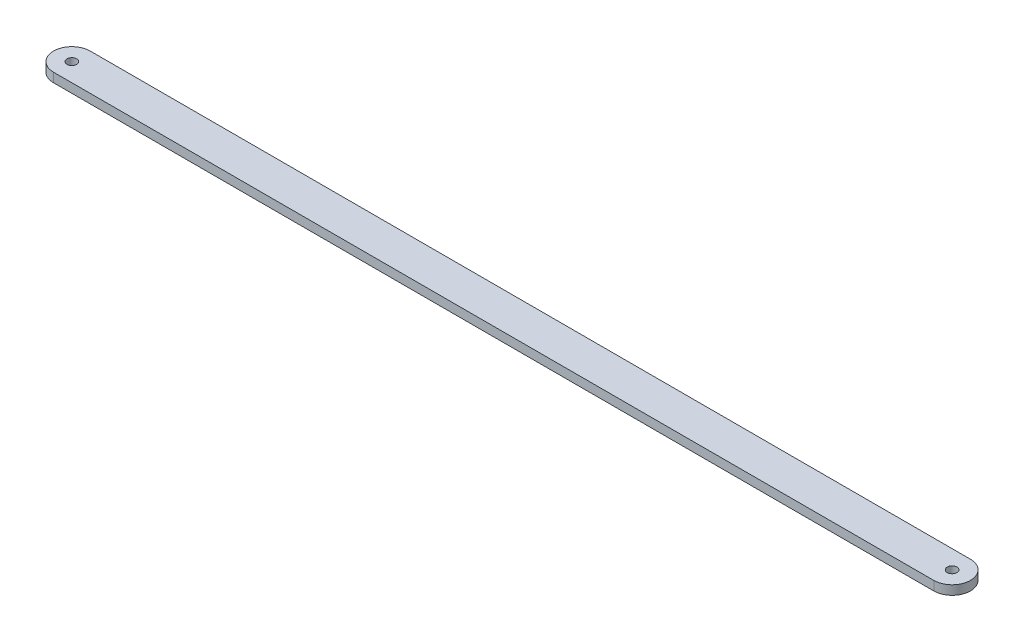
ISO-10303-21;
HEADER;
FILE_DESCRIPTION(('STEP AP214'),'2;1');
FILE_NAME('part.step','',(''),(''),'','','');
FILE_SCHEMA(('AUTOMOTIVE_DESIGN { 1 0 10303 214 1 1 1 1 }'));
ENDSEC;
DATA;
#1=APPLICATION_CONTEXT('core data for automotive mechanical design processes');
#2=APPLICATION_PROTOCOL_DEFINITION('international standard','automotive_design',2000,#1);
#3=PRODUCT_CONTEXT('',#1,'mechanical');
#4=PRODUCT('Part','Part','',(#3));
#5=PRODUCT_RELATED_PRODUCT_CATEGORY('part','',(#4));
#6=PRODUCT_DEFINITION_FORMATION('','',#4);
#7=PRODUCT_DEFINITION_CONTEXT('part definition',#1,'design');
#8=PRODUCT_DEFINITION('design','',#6,#7);
#9=PRODUCT_DEFINITION_SHAPE('','',#8);
#10=(LENGTH_UNIT() NAMED_UNIT(*) SI_UNIT(.MILLI.,.METRE.));
#11=(NAMED_UNIT(*) PLANE_ANGLE_UNIT() SI_UNIT($,.RADIAN.));
#12=(NAMED_UNIT(*) SI_UNIT($,.STERADIAN.) SOLID_ANGLE_UNIT());
#13=UNCERTAINTY_MEASURE_WITH_UNIT(LENGTH_MEASURE(1.E-05),#10,'distance_accuracy_value','');
#14=(GEOMETRIC_REPRESENTATION_CONTEXT(3) GLOBAL_UNCERTAINTY_ASSIGNED_CONTEXT((#13)) GLOBAL_UNIT_ASSIGNED_CONTEXT((#10,
#11,#12)) REPRESENTATION_CONTEXT('',''));
#15=CARTESIAN_POINT('',(0.,0.,0.));
#16=DIRECTION('',(0.,0.,1.));
#17=DIRECTION('',(1.,0.,0.));
#18=AXIS2_PLACEMENT_3D('',#15,#16,#17);
#19=CARTESIAN_POINT('',(-304.8,6.35,0.));
#20=DIRECTION('',(0.,1.,0.));
#21=DIRECTION('',(0.,0.,1.));
#22=AXIS2_PLACEMENT_3D('',#19,#20,#21);
#23=PLANE('',#22);
#24=CARTESIAN_POINT('',(304.8,6.35,0.));
#25=DIRECTION('',(0.,1.,0.));
#26=DIRECTION('',(0.,0.,1.));
#27=AXIS2_PLACEMENT_3D('',#24,#25,#26);
#28=CIRCLE('',#27,3.36550000000002);
#29=CARTESIAN_POINT('',(304.8,6.35,3.36550000000002));
#30=VERTEX_POINT('',#29);
#31=EDGE_CURVE('E112',#30,#30,#28,.T.);
#32=ORIENTED_EDGE('',*,*,#31,.F.);
#33=EDGE_LOOP('',(#32));
#34=FACE_BOUND('',#33,.T.);
#35=CARTESIAN_POINT('',(-304.8,6.35,0.));
#36=DIRECTION('',(0.,1.,0.));
#37=DIRECTION('',(0.,0.,1.));
#38=AXIS2_PLACEMENT_3D('',#35,#36,#37);
#39=CIRCLE('',#38,12.7);
#40=CARTESIAN_POINT('',(-304.8,6.35,-12.7000000000001));
#41=VERTEX_POINT('',#40);
#42=CARTESIAN_POINT('',(-304.8,6.35,12.6999999999999));
#43=VERTEX_POINT('',#42);
#44=EDGE_CURVE('E92',#41,#43,#39,.T.);
#45=ORIENTED_EDGE('',*,*,#44,.T.);
#46=DIRECTION('',(1.,0.,0.));
#47=VECTOR('',#46,1.);
#48=CARTESIAN_POINT('',(-304.8,6.35,12.6999999999999));
#49=LINE('',#48,#47);
#50=CARTESIAN_POINT('',(304.8,6.35,12.7000000000001));
#51=VERTEX_POINT('',#50);
#52=EDGE_CURVE('E87',#43,#51,#49,.T.);
#53=ORIENTED_EDGE('',*,*,#52,.T.);
#54=CARTESIAN_POINT('',(304.8,6.35,0.));
#55=DIRECTION('',(0.,1.,0.));
#56=DIRECTION('',(0.,0.,1.));
#57=AXIS2_PLACEMENT_3D('',#54,#55,#56);
#58=CIRCLE('',#57,12.7000000000001);
#59=CARTESIAN_POINT('',(304.8,6.35,-12.7000000000002));
#60=VERTEX_POINT('',#59);
#61=EDGE_CURVE('E90',#51,#60,#58,.T.);
#62=ORIENTED_EDGE('',*,*,#61,.T.);
#63=DIRECTION('',(-1.,0.,0.));
#64=VECTOR('',#63,1.);
#65=CARTESIAN_POINT('',(-304.8,6.35,-12.7000000000001));
#66=LINE('',#65,#64);
#67=EDGE_CURVE('E57',#60,#41,#66,.T.);
#68=ORIENTED_EDGE('',*,*,#67,.T.);
#69=EDGE_LOOP('',(#45,#53,#62,#68));
#70=FACE_BOUND('',#69,.T.);
#71=CARTESIAN_POINT('',(-304.8,6.35,0.));
#72=DIRECTION('',(0.,1.,0.));
#73=DIRECTION('',(0.,0.,1.));
#74=AXIS2_PLACEMENT_3D('',#71,#72,#73);
#75=CIRCLE('',#74,3.36550000000002);
#76=CARTESIAN_POINT('',(-304.8,6.35,3.36550000000002));
#77=VERTEX_POINT('',#76);
#78=EDGE_CURVE('E134',#77,#77,#75,.T.);
#79=ORIENTED_EDGE('',*,*,#78,.F.);
#80=EDGE_LOOP('',(#79));
#81=FACE_BOUND('',#80,.T.);
#82=ADVANCED_FACE('F39',(#34,#70,#81),#23,.T.);
#83=CARTESIAN_POINT('',(-304.8,0.,0.));
#84=DIRECTION('',(0.,1.,0.));
#85=DIRECTION('',(0.,0.,1.));
#86=AXIS2_PLACEMENT_3D('',#83,#84,#85);
#87=PLANE('',#86);
#88=CARTESIAN_POINT('',(-304.8,0.,0.));
#89=DIRECTION('',(0.,1.,0.));
#90=DIRECTION('',(0.,0.,1.));
#91=AXIS2_PLACEMENT_3D('',#88,#89,#90);
#92=CIRCLE('',#91,12.7);
#93=CARTESIAN_POINT('',(-304.8,0.,-12.7000000000001));
#94=VERTEX_POINT('',#93);
#95=CARTESIAN_POINT('',(-304.8,0.,12.6999999999999));
#96=VERTEX_POINT('',#95);
#97=EDGE_CURVE('E108',#94,#96,#92,.T.);
#98=ORIENTED_EDGE('',*,*,#97,.F.);
#99=DIRECTION('',(-1.,0.,0.));
#100=VECTOR('',#99,1.);
#101=CARTESIAN_POINT('',(-304.8,0.,-12.7000000000001));
#102=LINE('',#101,#100);
#103=CARTESIAN_POINT('',(304.8,0.,-12.7000000000002));
#104=VERTEX_POINT('',#103);
#105=EDGE_CURVE('E80',#104,#94,#102,.T.);
#106=ORIENTED_EDGE('',*,*,#105,.F.);
#107=CARTESIAN_POINT('',(304.8,0.,0.));
#108=DIRECTION('',(0.,1.,0.));
#109=DIRECTION('',(0.,0.,1.));
#110=AXIS2_PLACEMENT_3D('',#107,#108,#109);
#111=CIRCLE('',#110,12.7000000000001);
#112=CARTESIAN_POINT('',(304.8,0.,12.7000000000001));
#113=VERTEX_POINT('',#112);
#114=EDGE_CURVE('E74',#113,#104,#111,.T.);
#115=ORIENTED_EDGE('',*,*,#114,.F.);
#116=DIRECTION('',(1.,0.,0.));
#117=VECTOR('',#116,1.);
#118=CARTESIAN_POINT('',(-304.8,0.,12.6999999999999));
#119=LINE('',#118,#117);
#120=EDGE_CURVE('E97',#96,#113,#119,.T.);
#121=ORIENTED_EDGE('',*,*,#120,.F.);
#122=EDGE_LOOP('',(#98,#106,#115,#121));
#123=FACE_BOUND('',#122,.T.);
#124=CARTESIAN_POINT('',(304.8,0.,0.));
#125=DIRECTION('',(0.,1.,0.));
#126=DIRECTION('',(0.,0.,1.));
#127=AXIS2_PLACEMENT_3D('',#124,#125,#126);
#128=CIRCLE('',#127,3.36550000000002);
#129=CARTESIAN_POINT('',(304.8,0.,3.36550000000002));
#130=VERTEX_POINT('',#129);
#131=EDGE_CURVE('E130',#130,#130,#128,.T.);
#132=ORIENTED_EDGE('',*,*,#131,.T.);
#133=EDGE_LOOP('',(#132));
#134=FACE_BOUND('',#133,.T.);
#135=CARTESIAN_POINT('',(-304.8,0.,0.));
#136=DIRECTION('',(0.,1.,0.));
#137=DIRECTION('',(0.,0.,1.));
#138=AXIS2_PLACEMENT_3D('',#135,#136,#137);
#139=CIRCLE('',#138,3.36550000000002);
#140=CARTESIAN_POINT('',(-304.8,0.,3.36550000000002));
#141=VERTEX_POINT('',#140);
#142=EDGE_CURVE('E138',#141,#141,#139,.T.);
#143=ORIENTED_EDGE('',*,*,#142,.T.);
#144=EDGE_LOOP('',(#143));
#145=FACE_BOUND('',#144,.T.);
#146=ADVANCED_FACE('F125',(#123,#134,#145),#87,.F.);
#147=CARTESIAN_POINT('',(-304.8,6.35,0.));
#148=DIRECTION('',(0.,-1.,0.));
#149=DIRECTION('',(0.,0.,-1.));
#150=AXIS2_PLACEMENT_3D('',#147,#148,#149);
#151=CYLINDRICAL_SURFACE('',#150,12.7);
#152=ORIENTED_EDGE('',*,*,#97,.T.);
#153=DIRECTION('',(0.,-1.,0.));
#154=VECTOR('',#153,1.);
#155=CARTESIAN_POINT('',(-304.8,6.35,12.6999999999999));
#156=LINE('',#155,#154);
#157=EDGE_CURVE('E11',#43,#96,#156,.T.);
#158=ORIENTED_EDGE('',*,*,#157,.F.);
#159=ORIENTED_EDGE('',*,*,#44,.F.);
#160=DIRECTION('',(0.,-1.,0.));
#161=VECTOR('',#160,1.);
#162=CARTESIAN_POINT('',(-304.8,6.35,-12.7000000000001));
#163=LINE('',#162,#161);
#164=EDGE_CURVE('E104',#41,#94,#163,.T.);
#165=ORIENTED_EDGE('',*,*,#164,.T.);
#166=EDGE_LOOP('',(#152,#158,#159,#165));
#167=FACE_BOUND('',#166,.T.);
#168=ADVANCED_FACE('F41',(#167),#151,.T.);
#169=CARTESIAN_POINT('',(-304.8,6.35,12.6999999999999));
#170=DIRECTION('',(0.,0.,-1.));
#171=DIRECTION('',(-1.,0.,0.));
#172=AXIS2_PLACEMENT_3D('',#169,#170,#171);
#173=PLANE('',#172);
#174=ORIENTED_EDGE('',*,*,#120,.T.);
#175=DIRECTION('',(0.,-1.,0.));
#176=VECTOR('',#175,1.);
#177=CARTESIAN_POINT('',(304.8,6.35,12.7000000000001));
#178=LINE('',#177,#176);
#179=EDGE_CURVE('E49',#51,#113,#178,.T.);
#180=ORIENTED_EDGE('',*,*,#179,.F.);
#181=ORIENTED_EDGE('',*,*,#52,.F.);
#182=ORIENTED_EDGE('',*,*,#157,.T.);
#183=EDGE_LOOP('',(#174,#180,#181,#182));
#184=FACE_BOUND('',#183,.T.);
#185=ADVANCED_FACE('F96',(#184),#173,.F.);
#186=CARTESIAN_POINT('',(304.8,6.35,0.));
#187=DIRECTION('',(0.,-1.,0.));
#188=DIRECTION('',(0.,0.,-1.));
#189=AXIS2_PLACEMENT_3D('',#186,#187,#188);
#190=CYLINDRICAL_SURFACE('',#189,12.7000000000001);
#191=ORIENTED_EDGE('',*,*,#114,.T.);
#192=DIRECTION('',(0.,-1.,0.));
#193=VECTOR('',#192,1.);
#194=CARTESIAN_POINT('',(304.8,6.35,-12.7000000000002));
#195=LINE('',#194,#193);
#196=EDGE_CURVE('E99',#60,#104,#195,.T.);
#197=ORIENTED_EDGE('',*,*,#196,.F.);
#198=ORIENTED_EDGE('',*,*,#61,.F.);
#199=ORIENTED_EDGE('',*,*,#179,.T.);
#200=EDGE_LOOP('',(#191,#197,#198,#199));
#201=FACE_BOUND('',#200,.T.);
#202=ADVANCED_FACE('F100',(#201),#190,.T.);
#203=CARTESIAN_POINT('',(-304.8,6.35,-12.7000000000001));
#204=DIRECTION('',(0.,0.,1.));
#205=DIRECTION('',(1.,0.,0.));
#206=AXIS2_PLACEMENT_3D('',#203,#204,#205);
#207=PLANE('',#206);
#208=ORIENTED_EDGE('',*,*,#105,.T.);
#209=ORIENTED_EDGE('',*,*,#164,.F.);
#210=ORIENTED_EDGE('',*,*,#67,.F.);
#211=ORIENTED_EDGE('',*,*,#196,.T.);
#212=EDGE_LOOP('',(#208,#209,#210,#211));
#213=FACE_BOUND('',#212,.T.);
#214=ADVANCED_FACE('F122',(#213),#207,.F.);
#215=CARTESIAN_POINT('',(304.8,6.35,0.));
#216=DIRECTION('',(0.,-1.,0.));
#217=DIRECTION('',(0.,0.,-1.));
#218=AXIS2_PLACEMENT_3D('',#215,#216,#217);
#219=CYLINDRICAL_SURFACE('',#218,3.36550000000002);
#220=ORIENTED_EDGE('',*,*,#31,.T.);
#221=EDGE_LOOP('',(#220));
#222=FACE_BOUND('',#221,.T.);
#223=ORIENTED_EDGE('',*,*,#131,.F.);
#224=EDGE_LOOP('',(#223));
#225=FACE_BOUND('',#224,.T.);
#226=ADVANCED_FACE('F157',(#222,#225),#219,.F.);
#227=CARTESIAN_POINT('',(-304.8,6.35,0.));
#228=DIRECTION('',(0.,-1.,0.));
#229=DIRECTION('',(0.,0.,-1.));
#230=AXIS2_PLACEMENT_3D('',#227,#228,#229);
#231=CYLINDRICAL_SURFACE('',#230,3.36550000000002);
#232=ORIENTED_EDGE('',*,*,#78,.T.);
#233=EDGE_LOOP('',(#232));
#234=FACE_BOUND('',#233,.T.);
#235=ORIENTED_EDGE('',*,*,#142,.F.);
#236=EDGE_LOOP('',(#235));
#237=FACE_BOUND('',#236,.T.);
#238=ADVANCED_FACE('F146',(#234,#237),#231,.F.);
#239=CLOSED_SHELL('',(#82,#146,#168,#185,#202,#214,#226,#238));
#240=MANIFOLD_SOLID_BREP('B2',#239);
#241=ADVANCED_BREP_SHAPE_REPRESENTATION('',(#18,#240),#14);
#242=SHAPE_DEFINITION_REPRESENTATION(#9,#241);
ENDSEC;
END-ISO-10303-21;
